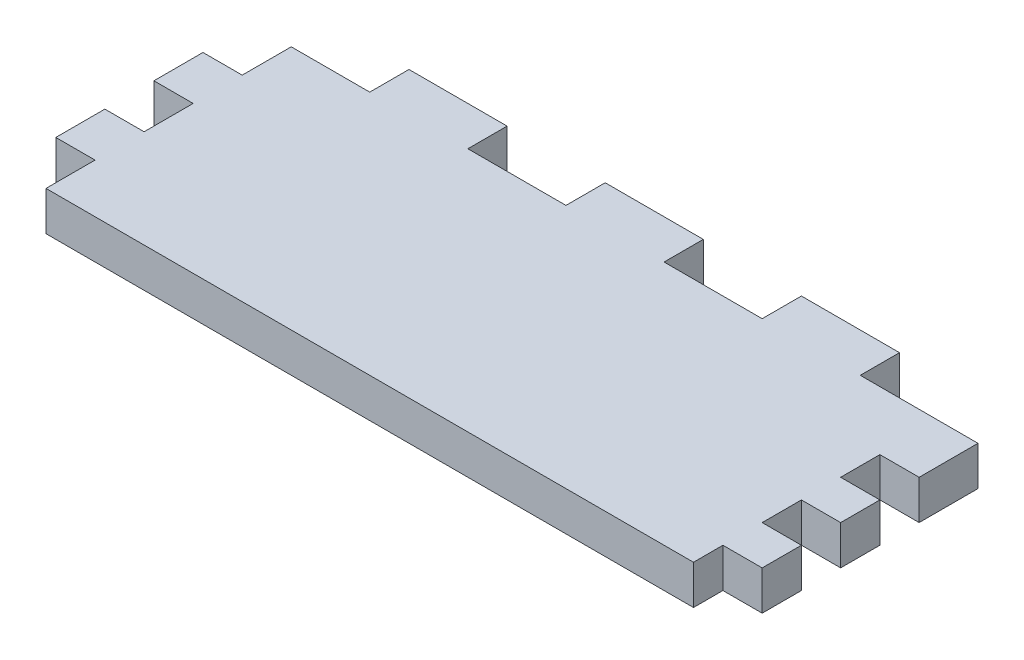
ISO-10303-21;
HEADER;
FILE_DESCRIPTION(('STEP AP214'),'2;1');
FILE_NAME('part.step','',(''),(''),'','','');
FILE_SCHEMA(('AUTOMOTIVE_DESIGN { 1 0 10303 214 1 1 1 1 }'));
ENDSEC;
DATA;
#1=APPLICATION_CONTEXT('core data for automotive mechanical design processes');
#2=APPLICATION_PROTOCOL_DEFINITION('international standard','automotive_design',2000,#1);
#3=PRODUCT_CONTEXT('',#1,'mechanical');
#4=PRODUCT('Part','Part','',(#3));
#5=PRODUCT_RELATED_PRODUCT_CATEGORY('part','',(#4));
#6=PRODUCT_DEFINITION_FORMATION('','',#4);
#7=PRODUCT_DEFINITION_CONTEXT('part definition',#1,'design');
#8=PRODUCT_DEFINITION('design','',#6,#7);
#9=PRODUCT_DEFINITION_SHAPE('','',#8);
#10=(LENGTH_UNIT() NAMED_UNIT(*) SI_UNIT(.MILLI.,.METRE.));
#11=(NAMED_UNIT(*) PLANE_ANGLE_UNIT() SI_UNIT($,.RADIAN.));
#12=(NAMED_UNIT(*) SI_UNIT($,.STERADIAN.) SOLID_ANGLE_UNIT());
#13=UNCERTAINTY_MEASURE_WITH_UNIT(LENGTH_MEASURE(1.E-05),#10,'distance_accuracy_value','');
#14=(GEOMETRIC_REPRESENTATION_CONTEXT(3) GLOBAL_UNCERTAINTY_ASSIGNED_CONTEXT((#13)) GLOBAL_UNIT_ASSIGNED_CONTEXT((#10,
#11,#12)) REPRESENTATION_CONTEXT('',''));
#15=CARTESIAN_POINT('',(0.,0.,0.));
#16=DIRECTION('',(0.,0.,1.));
#17=DIRECTION('',(1.,0.,0.));
#18=AXIS2_PLACEMENT_3D('',#15,#16,#17);
#19=CARTESIAN_POINT('',(66.,4.,0.));
#20=DIRECTION('',(-1.,0.,0.));
#21=DIRECTION('',(0.,0.,1.));
#22=AXIS2_PLACEMENT_3D('',#19,#20,#21);
#23=PLANE('',#22);
#24=DIRECTION('',(0.,0.,-1.));
#25=VECTOR('',#24,1.);
#26=CARTESIAN_POINT('',(66.,4.,0.));
#27=LINE('',#26,#25);
#28=CARTESIAN_POINT('',(66.,4.,18.0000000000002));
#29=VERTEX_POINT('',#28);
#30=CARTESIAN_POINT('',(66.,4.,14.0000000000002));
#31=VERTEX_POINT('',#30);
#32=EDGE_CURVE('E52',#29,#31,#27,.T.);
#33=ORIENTED_EDGE('',*,*,#32,.F.);
#34=DIRECTION('',(0.,1.,0.));
#35=VECTOR('',#34,1.);
#36=CARTESIAN_POINT('',(66.,0.,18.0000000000002));
#37=LINE('',#36,#35);
#38=CARTESIAN_POINT('',(66.,0.,18.0000000000002));
#39=VERTEX_POINT('',#38);
#40=EDGE_CURVE('E292',#39,#29,#37,.T.);
#41=ORIENTED_EDGE('',*,*,#40,.F.);
#42=DIRECTION('',(0.,0.,-1.));
#43=VECTOR('',#42,1.);
#44=CARTESIAN_POINT('',(66.,0.,0.));
#45=LINE('',#44,#43);
#46=CARTESIAN_POINT('',(66.,0.,14.0000000000002));
#47=VERTEX_POINT('',#46);
#48=EDGE_CURVE('E504',#39,#47,#45,.T.);
#49=ORIENTED_EDGE('',*,*,#48,.T.);
#50=DIRECTION('',(0.,1.,0.));
#51=VECTOR('',#50,1.);
#52=CARTESIAN_POINT('',(66.,0.,14.0000000000002));
#53=LINE('',#52,#51);
#54=EDGE_CURVE('E307',#47,#31,#53,.T.);
#55=ORIENTED_EDGE('',*,*,#54,.T.);
#56=EDGE_LOOP('',(#33,#41,#49,#55));
#57=FACE_BOUND('',#56,.T.);
#58=ADVANCED_FACE('F37',(#57),#23,.F.);
#59=CARTESIAN_POINT('',(66.,4.,10.0000000000002));
#60=VERTEX_POINT('',#59);
#61=CARTESIAN_POINT('',(66.,4.,6.00000000000023));
#62=VERTEX_POINT('',#61);
#63=EDGE_CURVE('E484',#60,#62,#27,.T.);
#64=ORIENTED_EDGE('',*,*,#63,.F.);
#65=DIRECTION('',(0.,1.,0.));
#66=VECTOR('',#65,1.);
#67=CARTESIAN_POINT('',(66.,0.,10.0000000000002));
#68=LINE('',#67,#66);
#69=CARTESIAN_POINT('',(66.,0.,10.0000000000002));
#70=VERTEX_POINT('',#69);
#71=EDGE_CURVE('E315',#70,#60,#68,.T.);
#72=ORIENTED_EDGE('',*,*,#71,.F.);
#73=CARTESIAN_POINT('',(66.,0.,6.00000000000023));
#74=VERTEX_POINT('',#73);
#75=EDGE_CURVE('E500',#70,#74,#45,.T.);
#76=ORIENTED_EDGE('',*,*,#75,.T.);
#77=DIRECTION('',(0.,1.,0.));
#78=VECTOR('',#77,1.);
#79=CARTESIAN_POINT('',(66.,0.,6.00000000000023));
#80=LINE('',#79,#78);
#81=EDGE_CURVE('E331',#74,#62,#80,.T.);
#82=ORIENTED_EDGE('',*,*,#81,.T.);
#83=EDGE_LOOP('',(#64,#72,#76,#82));
#84=FACE_BOUND('',#83,.T.);
#85=ADVANCED_FACE('F557',(#84),#23,.F.);
#86=CARTESIAN_POINT('',(0.,4.,0.));
#87=DIRECTION('',(0.,0.,1.));
#88=DIRECTION('',(1.,0.,0.));
#89=AXIS2_PLACEMENT_3D('',#86,#87,#88);
#90=PLANE('',#89);
#91=DIRECTION('',(-1.,0.,0.));
#92=VECTOR('',#91,1.);
#93=CARTESIAN_POINT('',(0.,0.,0.));
#94=LINE('',#93,#92);
#95=CARTESIAN_POINT('',(70.0000000000006,0.,0.));
#96=VERTEX_POINT('',#95);
#97=CARTESIAN_POINT('',(58.,0.,0.));
#98=VERTEX_POINT('',#97);
#99=EDGE_CURVE('E505',#96,#98,#94,.T.);
#100=ORIENTED_EDGE('',*,*,#99,.T.);
#101=DIRECTION('',(0.,1.,0.));
#102=VECTOR('',#101,1.);
#103=CARTESIAN_POINT('',(58.,0.,0.));
#104=LINE('',#103,#102);
#105=CARTESIAN_POINT('',(58.,4.,0.));
#106=VERTEX_POINT('',#105);
#107=EDGE_CURVE('E362',#98,#106,#104,.T.);
#108=ORIENTED_EDGE('',*,*,#107,.T.);
#109=DIRECTION('',(-1.,0.,0.));
#110=VECTOR('',#109,1.);
#111=CARTESIAN_POINT('',(0.,4.,0.));
#112=LINE('',#111,#110);
#113=CARTESIAN_POINT('',(70.0000000000006,4.,0.));
#114=VERTEX_POINT('',#113);
#115=EDGE_CURVE('E488',#114,#106,#112,.T.);
#116=ORIENTED_EDGE('',*,*,#115,.F.);
#117=DIRECTION('',(0.,1.,0.));
#118=VECTOR('',#117,1.);
#119=CARTESIAN_POINT('',(70.0000000000006,0.,0.));
#120=LINE('',#119,#118);
#121=EDGE_CURVE('E336',#96,#114,#120,.T.);
#122=ORIENTED_EDGE('',*,*,#121,.F.);
#123=EDGE_LOOP('',(#100,#108,#116,#122));
#124=FACE_BOUND('',#123,.T.);
#125=ADVANCED_FACE('F563',(#124),#90,.F.);
#126=CARTESIAN_POINT('',(28.,0.,0.));
#127=VERTEX_POINT('',#126);
#128=CARTESIAN_POINT('',(18.,0.,0.));
#129=VERTEX_POINT('',#128);
#130=EDGE_CURVE('E508',#127,#129,#94,.T.);
#131=ORIENTED_EDGE('',*,*,#130,.T.);
#132=DIRECTION('',(0.,1.,0.));
#133=VECTOR('',#132,1.);
#134=CARTESIAN_POINT('',(18.,0.,0.));
#135=LINE('',#134,#133);
#136=CARTESIAN_POINT('',(18.,4.,0.));
#137=VERTEX_POINT('',#136);
#138=EDGE_CURVE('E389',#129,#137,#135,.T.);
#139=ORIENTED_EDGE('',*,*,#138,.T.);
#140=CARTESIAN_POINT('',(28.,4.,0.));
#141=VERTEX_POINT('',#140);
#142=EDGE_CURVE('E493',#141,#137,#112,.T.);
#143=ORIENTED_EDGE('',*,*,#142,.F.);
#144=DIRECTION('',(0.,1.,0.));
#145=VECTOR('',#144,1.);
#146=CARTESIAN_POINT('',(28.,0.,0.));
#147=LINE('',#146,#145);
#148=EDGE_CURVE('E419',#127,#141,#147,.T.);
#149=ORIENTED_EDGE('',*,*,#148,.F.);
#150=EDGE_LOOP('',(#131,#139,#143,#149));
#151=FACE_BOUND('',#150,.T.);
#152=ADVANCED_FACE('F587',(#151),#90,.F.);
#153=CARTESIAN_POINT('',(8.,4.,0.));
#154=VERTEX_POINT('',#153);
#155=CARTESIAN_POINT('',(0.,4.,0.));
#156=VERTEX_POINT('',#155);
#157=EDGE_CURVE('E487',#154,#156,#112,.T.);
#158=ORIENTED_EDGE('',*,*,#157,.F.);
#159=DIRECTION('',(0.,1.,0.));
#160=VECTOR('',#159,1.);
#161=CARTESIAN_POINT('',(8.,0.,0.));
#162=LINE('',#161,#160);
#163=CARTESIAN_POINT('',(8.,0.,0.));
#164=VERTEX_POINT('',#163);
#165=EDGE_CURVE('E392',#164,#154,#162,.T.);
#166=ORIENTED_EDGE('',*,*,#165,.F.);
#167=CARTESIAN_POINT('',(0.,0.,0.));
#168=VERTEX_POINT('',#167);
#169=EDGE_CURVE('E503',#164,#168,#94,.T.);
#170=ORIENTED_EDGE('',*,*,#169,.T.);
#171=DIRECTION('',(0.,-1.,0.));
#172=VECTOR('',#171,1.);
#173=CARTESIAN_POINT('',(0.,4.,0.));
#174=LINE('',#173,#172);
#175=EDGE_CURVE('E491',#156,#168,#174,.T.);
#176=ORIENTED_EDGE('',*,*,#175,.F.);
#177=EDGE_LOOP('',(#158,#166,#170,#176));
#178=FACE_BOUND('',#177,.T.);
#179=ADVANCED_FACE('F574',(#178),#90,.F.);
#180=CARTESIAN_POINT('',(0.,4.,0.));
#181=DIRECTION('',(1.,0.,0.));
#182=DIRECTION('',(0.,0.,-1.));
#183=AXIS2_PLACEMENT_3D('',#180,#181,#182);
#184=PLANE('',#183);
#185=DIRECTION('',(0.,0.,1.));
#186=VECTOR('',#185,1.);
#187=CARTESIAN_POINT('',(0.,4.,0.));
#188=LINE('',#187,#186);
#189=CARTESIAN_POINT('',(0.,4.,20.));
#190=VERTEX_POINT('',#189);
#191=CARTESIAN_POINT('',(0.,4.,25.));
#192=VERTEX_POINT('',#191);
#193=EDGE_CURVE('E482',#190,#192,#188,.T.);
#194=ORIENTED_EDGE('',*,*,#193,.F.);
#195=DIRECTION('',(0.,1.,0.));
#196=VECTOR('',#195,1.);
#197=CARTESIAN_POINT('',(0.,0.,20.));
#198=LINE('',#197,#196);
#199=CARTESIAN_POINT('',(0.,0.,20.));
#200=VERTEX_POINT('',#199);
#201=EDGE_CURVE('E442',#200,#190,#198,.T.);
#202=ORIENTED_EDGE('',*,*,#201,.F.);
#203=DIRECTION('',(0.,0.,1.));
#204=VECTOR('',#203,1.);
#205=CARTESIAN_POINT('',(0.,0.,0.));
#206=LINE('',#205,#204);
#207=CARTESIAN_POINT('',(0.,0.,25.));
#208=VERTEX_POINT('',#207);
#209=EDGE_CURVE('E470',#200,#208,#206,.T.);
#210=ORIENTED_EDGE('',*,*,#209,.T.);
#211=DIRECTION('',(0.,-1.,0.));
#212=VECTOR('',#211,1.);
#213=CARTESIAN_POINT('',(0.,4.,25.));
#214=LINE('',#213,#212);
#215=EDGE_CURVE('E11',#192,#208,#214,.T.);
#216=ORIENTED_EDGE('',*,*,#215,.F.);
#217=EDGE_LOOP('',(#194,#202,#210,#216));
#218=FACE_BOUND('',#217,.T.);
#219=ADVANCED_FACE('F521',(#218),#184,.F.);
#220=CARTESIAN_POINT('',(0.,0.,10.));
#221=VERTEX_POINT('',#220);
#222=CARTESIAN_POINT('',(0.,0.,15.));
#223=VERTEX_POINT('',#222);
#224=EDGE_CURVE('E498',#221,#223,#206,.T.);
#225=ORIENTED_EDGE('',*,*,#224,.T.);
#226=DIRECTION('',(0.,1.,0.));
#227=VECTOR('',#226,1.);
#228=CARTESIAN_POINT('',(0.,0.,15.));
#229=LINE('',#228,#227);
#230=CARTESIAN_POINT('',(0.,4.,15.));
#231=VERTEX_POINT('',#230);
#232=EDGE_CURVE('E434',#223,#231,#229,.T.);
#233=ORIENTED_EDGE('',*,*,#232,.T.);
#234=CARTESIAN_POINT('',(0.,4.,10.));
#235=VERTEX_POINT('',#234);
#236=EDGE_CURVE('E481',#235,#231,#188,.T.);
#237=ORIENTED_EDGE('',*,*,#236,.F.);
#238=DIRECTION('',(0.,1.,0.));
#239=VECTOR('',#238,1.);
#240=CARTESIAN_POINT('',(0.,0.,10.));
#241=LINE('',#240,#239);
#242=EDGE_CURVE('E468',#221,#235,#241,.T.);
#243=ORIENTED_EDGE('',*,*,#242,.F.);
#244=EDGE_LOOP('',(#225,#233,#237,#243));
#245=FACE_BOUND('',#244,.T.);
#246=ADVANCED_FACE('F526',(#245),#184,.F.);
#247=CARTESIAN_POINT('',(0.,0.,5.));
#248=VERTEX_POINT('',#247);
#249=EDGE_CURVE('E494',#168,#248,#206,.T.);
#250=ORIENTED_EDGE('',*,*,#249,.T.);
#251=DIRECTION('',(0.,1.,0.));
#252=VECTOR('',#251,1.);
#253=CARTESIAN_POINT('',(0.,0.,5.));
#254=LINE('',#253,#252);
#255=CARTESIAN_POINT('',(0.,4.,5.));
#256=VERTEX_POINT('',#255);
#257=EDGE_CURVE('E460',#248,#256,#254,.T.);
#258=ORIENTED_EDGE('',*,*,#257,.T.);
#259=EDGE_CURVE('E477',#156,#256,#188,.T.);
#260=ORIENTED_EDGE('',*,*,#259,.F.);
#261=ORIENTED_EDGE('',*,*,#175,.T.);
#262=EDGE_LOOP('',(#250,#258,#260,#261));
#263=FACE_BOUND('',#262,.T.);
#264=ADVANCED_FACE('F39',(#263),#184,.F.);
#265=CARTESIAN_POINT('',(0.,4.,25.));
#266=DIRECTION('',(0.,0.,-1.));
#267=DIRECTION('',(-1.,0.,0.));
#268=AXIS2_PLACEMENT_3D('',#265,#266,#267);
#269=PLANE('',#268);
#270=DIRECTION('',(1.,0.,0.));
#271=VECTOR('',#270,1.);
#272=CARTESIAN_POINT('',(0.,0.,25.));
#273=LINE('',#272,#271);
#274=CARTESIAN_POINT('',(66.,0.,25.));
#275=VERTEX_POINT('',#274);
#276=EDGE_CURVE('E497',#208,#275,#273,.T.);
#277=ORIENTED_EDGE('',*,*,#276,.T.);
#278=DIRECTION('',(0.,-1.,0.));
#279=VECTOR('',#278,1.);
#280=CARTESIAN_POINT('',(66.,4.,25.));
#281=LINE('',#280,#279);
#282=CARTESIAN_POINT('',(66.,4.,25.));
#283=VERTEX_POINT('',#282);
#284=EDGE_CURVE('E45',#283,#275,#281,.T.);
#285=ORIENTED_EDGE('',*,*,#284,.F.);
#286=DIRECTION('',(1.,0.,0.));
#287=VECTOR('',#286,1.);
#288=CARTESIAN_POINT('',(0.,4.,25.));
#289=LINE('',#288,#287);
#290=EDGE_CURVE('E480',#192,#283,#289,.T.);
#291=ORIENTED_EDGE('',*,*,#290,.F.);
#292=ORIENTED_EDGE('',*,*,#215,.T.);
#293=EDGE_LOOP('',(#277,#285,#291,#292));
#294=FACE_BOUND('',#293,.T.);
#295=ADVANCED_FACE('F519',(#294),#269,.F.);
#296=CARTESIAN_POINT('',(66.,0.,22.0000000000001));
#297=VERTEX_POINT('',#296);
#298=EDGE_CURVE('E501',#275,#297,#45,.T.);
#299=ORIENTED_EDGE('',*,*,#298,.T.);
#300=DIRECTION('',(0.,1.,0.));
#301=VECTOR('',#300,1.);
#302=CARTESIAN_POINT('',(66.,0.,22.0000000000001));
#303=LINE('',#302,#301);
#304=CARTESIAN_POINT('',(66.,4.,22.0000000000001));
#305=VERTEX_POINT('',#304);
#306=EDGE_CURVE('E60',#297,#305,#303,.T.);
#307=ORIENTED_EDGE('',*,*,#306,.T.);
#308=EDGE_CURVE('E485',#283,#305,#27,.T.);
#309=ORIENTED_EDGE('',*,*,#308,.F.);
#310=ORIENTED_EDGE('',*,*,#284,.T.);
#311=EDGE_LOOP('',(#299,#307,#309,#310));
#312=FACE_BOUND('',#311,.T.);
#313=ADVANCED_FACE('F512',(#312),#23,.F.);
#314=CARTESIAN_POINT('',(48.,4.,0.));
#315=VERTEX_POINT('',#314);
#316=CARTESIAN_POINT('',(38.,4.,0.));
#317=VERTEX_POINT('',#316);
#318=EDGE_CURVE('E492',#315,#317,#112,.T.);
#319=ORIENTED_EDGE('',*,*,#318,.F.);
#320=DIRECTION('',(0.,1.,0.));
#321=VECTOR('',#320,1.);
#322=CARTESIAN_POINT('',(48.,0.,0.));
#323=LINE('',#322,#321);
#324=CARTESIAN_POINT('',(48.,0.,0.));
#325=VERTEX_POINT('',#324);
#326=EDGE_CURVE('E365',#325,#315,#323,.T.);
#327=ORIENTED_EDGE('',*,*,#326,.F.);
#328=CARTESIAN_POINT('',(38.,0.,0.));
#329=VERTEX_POINT('',#328);
#330=EDGE_CURVE('E507',#325,#329,#94,.T.);
#331=ORIENTED_EDGE('',*,*,#330,.T.);
#332=DIRECTION('',(0.,1.,0.));
#333=VECTOR('',#332,1.);
#334=CARTESIAN_POINT('',(38.,0.,0.));
#335=LINE('',#334,#333);
#336=EDGE_CURVE('E415',#329,#317,#335,.T.);
#337=ORIENTED_EDGE('',*,*,#336,.T.);
#338=EDGE_LOOP('',(#319,#327,#331,#337));
#339=FACE_BOUND('',#338,.T.);
#340=ADVANCED_FACE('F567',(#339),#90,.F.);
#341=CARTESIAN_POINT('',(0.,4.,0.));
#342=DIRECTION('',(0.,1.,0.));
#343=DIRECTION('',(0.,0.,1.));
#344=AXIS2_PLACEMENT_3D('',#341,#342,#343);
#345=PLANE('',#344);
#346=ORIENTED_EDGE('',*,*,#259,.T.);
#347=DIRECTION('',(-1.,0.,0.));
#348=VECTOR('',#347,1.);
#349=CARTESIAN_POINT('',(0.,4.,5.));
#350=LINE('',#349,#348);
#351=CARTESIAN_POINT('',(-4.,4.,5.));
#352=VERTEX_POINT('',#351);
#353=EDGE_CURVE('E445',#256,#352,#350,.T.);
#354=ORIENTED_EDGE('',*,*,#353,.T.);
#355=DIRECTION('',(0.,0.,1.));
#356=VECTOR('',#355,1.);
#357=CARTESIAN_POINT('',(-4.,4.,5.));
#358=LINE('',#357,#356);
#359=CARTESIAN_POINT('',(-4.,4.,10.));
#360=VERTEX_POINT('',#359);
#361=EDGE_CURVE('E463',#352,#360,#358,.T.);
#362=ORIENTED_EDGE('',*,*,#361,.T.);
#363=DIRECTION('',(1.,0.,0.));
#364=VECTOR('',#363,1.);
#365=CARTESIAN_POINT('',(0.,4.,10.));
#366=LINE('',#365,#364);
#367=EDGE_CURVE('E455',#360,#235,#366,.T.);
#368=ORIENTED_EDGE('',*,*,#367,.T.);
#369=ORIENTED_EDGE('',*,*,#236,.T.);
#370=DIRECTION('',(-1.,0.,0.));
#371=VECTOR('',#370,1.);
#372=CARTESIAN_POINT('',(0.,4.,15.));
#373=LINE('',#372,#371);
#374=CARTESIAN_POINT('',(-4.,4.,15.));
#375=VERTEX_POINT('',#374);
#376=EDGE_CURVE('E418',#231,#375,#373,.T.);
#377=ORIENTED_EDGE('',*,*,#376,.T.);
#378=DIRECTION('',(0.,0.,1.));
#379=VECTOR('',#378,1.);
#380=CARTESIAN_POINT('',(-4.,4.,15.));
#381=LINE('',#380,#379);
#382=CARTESIAN_POINT('',(-4.,4.,20.));
#383=VERTEX_POINT('',#382);
#384=EDGE_CURVE('E437',#375,#383,#381,.T.);
#385=ORIENTED_EDGE('',*,*,#384,.T.);
#386=DIRECTION('',(1.,0.,0.));
#387=VECTOR('',#386,1.);
#388=CARTESIAN_POINT('',(0.,4.,20.));
#389=LINE('',#388,#387);
#390=EDGE_CURVE('E428',#383,#190,#389,.T.);
#391=ORIENTED_EDGE('',*,*,#390,.T.);
#392=ORIENTED_EDGE('',*,*,#193,.T.);
#393=ORIENTED_EDGE('',*,*,#290,.T.);
#394=ORIENTED_EDGE('',*,*,#308,.T.);
#395=DIRECTION('',(1.,0.,0.));
#396=VECTOR('',#395,1.);
#397=CARTESIAN_POINT('',(66.,4.,22.0000000000001));
#398=LINE('',#397,#396);
#399=CARTESIAN_POINT('',(70.0000000000006,4.,22.0000000000001));
#400=VERTEX_POINT('',#399);
#401=EDGE_CURVE('E289',#305,#400,#398,.T.);
#402=ORIENTED_EDGE('',*,*,#401,.T.);
#403=DIRECTION('',(0.,0.,-1.));
#404=VECTOR('',#403,1.);
#405=CARTESIAN_POINT('',(70.0000000000006,4.,18.0000000000002));
#406=LINE('',#405,#404);
#407=CARTESIAN_POINT('',(70.0000000000006,4.,18.0000000000002));
#408=VERTEX_POINT('',#407);
#409=EDGE_CURVE('E266',#400,#408,#406,.T.);
#410=ORIENTED_EDGE('',*,*,#409,.T.);
#411=DIRECTION('',(-1.,0.,0.));
#412=VECTOR('',#411,1.);
#413=CARTESIAN_POINT('',(66.,4.,18.0000000000002));
#414=LINE('',#413,#412);
#415=EDGE_CURVE('E283',#408,#29,#414,.T.);
#416=ORIENTED_EDGE('',*,*,#415,.T.);
#417=ORIENTED_EDGE('',*,*,#32,.T.);
#418=DIRECTION('',(1.,0.,0.));
#419=VECTOR('',#418,1.);
#420=CARTESIAN_POINT('',(66.,4.,14.0000000000002));
#421=LINE('',#420,#419);
#422=CARTESIAN_POINT('',(70.0000000000006,4.,14.0000000000002));
#423=VERTEX_POINT('',#422);
#424=EDGE_CURVE('E294',#31,#423,#421,.T.);
#425=ORIENTED_EDGE('',*,*,#424,.T.);
#426=DIRECTION('',(0.,0.,-1.));
#427=VECTOR('',#426,1.);
#428=CARTESIAN_POINT('',(70.0000000000006,4.,10.0000000000002));
#429=LINE('',#428,#427);
#430=CARTESIAN_POINT('',(70.0000000000006,4.,10.0000000000002));
#431=VERTEX_POINT('',#430);
#432=EDGE_CURVE('E310',#423,#431,#429,.T.);
#433=ORIENTED_EDGE('',*,*,#432,.T.);
#434=DIRECTION('',(-1.,0.,0.));
#435=VECTOR('',#434,1.);
#436=CARTESIAN_POINT('',(66.,4.,10.0000000000002));
#437=LINE('',#436,#435);
#438=EDGE_CURVE('E301',#431,#60,#437,.T.);
#439=ORIENTED_EDGE('',*,*,#438,.T.);
#440=ORIENTED_EDGE('',*,*,#63,.T.);
#441=DIRECTION('',(1.,0.,0.));
#442=VECTOR('',#441,1.);
#443=CARTESIAN_POINT('',(66.,4.,6.00000000000023));
#444=LINE('',#443,#442);
#445=CARTESIAN_POINT('',(70.0000000000006,4.,6.00000000000023));
#446=VERTEX_POINT('',#445);
#447=EDGE_CURVE('E318',#62,#446,#444,.T.);
#448=ORIENTED_EDGE('',*,*,#447,.T.);
#449=DIRECTION('',(0.,0.,-1.));
#450=VECTOR('',#449,1.);
#451=CARTESIAN_POINT('',(70.0000000000006,4.,0.));
#452=LINE('',#451,#450);
#453=EDGE_CURVE('E328',#446,#114,#452,.T.);
#454=ORIENTED_EDGE('',*,*,#453,.T.);
#455=ORIENTED_EDGE('',*,*,#115,.T.);
#456=DIRECTION('',(0.,0.,-1.));
#457=VECTOR('',#456,1.);
#458=CARTESIAN_POINT('',(58.,4.,0.));
#459=LINE('',#458,#457);
#460=CARTESIAN_POINT('',(58.,4.,-3.99999999999999));
#461=VERTEX_POINT('',#460);
#462=EDGE_CURVE('E339',#106,#461,#459,.T.);
#463=ORIENTED_EDGE('',*,*,#462,.T.);
#464=DIRECTION('',(-1.,0.,0.));
#465=VECTOR('',#464,1.);
#466=CARTESIAN_POINT('',(48.,4.,-3.99999999999999));
#467=LINE('',#466,#465);
#468=CARTESIAN_POINT('',(48.,4.,-3.99999999999999));
#469=VERTEX_POINT('',#468);
#470=EDGE_CURVE('E357',#461,#469,#467,.T.);
#471=ORIENTED_EDGE('',*,*,#470,.T.);
#472=DIRECTION('',(0.,0.,1.));
#473=VECTOR('',#472,1.);
#474=CARTESIAN_POINT('',(48.,4.,0.));
#475=LINE('',#474,#473);
#476=EDGE_CURVE('E348',#469,#315,#475,.T.);
#477=ORIENTED_EDGE('',*,*,#476,.T.);
#478=ORIENTED_EDGE('',*,*,#318,.T.);
#479=DIRECTION('',(0.,0.,-1.));
#480=VECTOR('',#479,1.);
#481=CARTESIAN_POINT('',(38.,4.,0.));
#482=LINE('',#481,#480);
#483=CARTESIAN_POINT('',(38.,4.,-3.99999999999999));
#484=VERTEX_POINT('',#483);
#485=EDGE_CURVE('E391',#317,#484,#482,.T.);
#486=ORIENTED_EDGE('',*,*,#485,.T.);
#487=DIRECTION('',(-1.,0.,0.));
#488=VECTOR('',#487,1.);
#489=CARTESIAN_POINT('',(28.,4.,-3.99999999999999));
#490=LINE('',#489,#488);
#491=CARTESIAN_POINT('',(28.,4.,-3.99999999999999));
#492=VERTEX_POINT('',#491);
#493=EDGE_CURVE('E410',#484,#492,#490,.T.);
#494=ORIENTED_EDGE('',*,*,#493,.T.);
#495=DIRECTION('',(0.,0.,1.));
#496=VECTOR('',#495,1.);
#497=CARTESIAN_POINT('',(28.,4.,0.));
#498=LINE('',#497,#496);
#499=EDGE_CURVE('E402',#492,#141,#498,.T.);
#500=ORIENTED_EDGE('',*,*,#499,.T.);
#501=ORIENTED_EDGE('',*,*,#142,.T.);
#502=DIRECTION('',(0.,0.,-1.));
#503=VECTOR('',#502,1.);
#504=CARTESIAN_POINT('',(18.,4.,0.));
#505=LINE('',#504,#503);
#506=CARTESIAN_POINT('',(18.,4.,-4.));
#507=VERTEX_POINT('',#506);
#508=EDGE_CURVE('E364',#137,#507,#505,.T.);
#509=ORIENTED_EDGE('',*,*,#508,.T.);
#510=DIRECTION('',(-1.,0.,0.));
#511=VECTOR('',#510,1.);
#512=CARTESIAN_POINT('',(8.,4.,-4.));
#513=LINE('',#512,#511);
#514=CARTESIAN_POINT('',(8.,4.,-4.));
#515=VERTEX_POINT('',#514);
#516=EDGE_CURVE('E384',#507,#515,#513,.T.);
#517=ORIENTED_EDGE('',*,*,#516,.T.);
#518=DIRECTION('',(0.,0.,1.));
#519=VECTOR('',#518,1.);
#520=CARTESIAN_POINT('',(8.,4.,0.));
#521=LINE('',#520,#519);
#522=EDGE_CURVE('E375',#515,#154,#521,.T.);
#523=ORIENTED_EDGE('',*,*,#522,.T.);
#524=ORIENTED_EDGE('',*,*,#157,.T.);
#525=EDGE_LOOP('',(#346,#354,#362,#368,#369,#377,#385,#391,#392,#393,#394,#402,#410,#416,#417,
#425,#433,#439,#440,#448,#454,#455,#463,#471,#477,#478,#486,#494,#500,#501,#509,#517,#523,#524));
#526=FACE_BOUND('',#525,.T.);
#527=ADVANCED_FACE('F540',(#526),#345,.T.);
#528=CARTESIAN_POINT('',(0.,0.,0.));
#529=DIRECTION('',(0.,1.,0.));
#530=DIRECTION('',(0.,0.,1.));
#531=AXIS2_PLACEMENT_3D('',#528,#529,#530);
#532=PLANE('',#531);
#533=ORIENTED_EDGE('',*,*,#249,.F.);
#534=ORIENTED_EDGE('',*,*,#169,.F.);
#535=DIRECTION('',(0.,0.,1.));
#536=VECTOR('',#535,1.);
#537=CARTESIAN_POINT('',(8.,0.,0.));
#538=LINE('',#537,#536);
#539=CARTESIAN_POINT('',(8.,0.,-4.));
#540=VERTEX_POINT('',#539);
#541=EDGE_CURVE('E378',#540,#164,#538,.T.);
#542=ORIENTED_EDGE('',*,*,#541,.F.);
#543=DIRECTION('',(-1.,0.,0.));
#544=VECTOR('',#543,1.);
#545=CARTESIAN_POINT('',(8.,0.,-4.));
#546=LINE('',#545,#544);
#547=CARTESIAN_POINT('',(18.,0.,-4.));
#548=VERTEX_POINT('',#547);
#549=EDGE_CURVE('E374',#548,#540,#546,.T.);
#550=ORIENTED_EDGE('',*,*,#549,.F.);
#551=DIRECTION('',(0.,0.,-1.));
#552=VECTOR('',#551,1.);
#553=CARTESIAN_POINT('',(18.,0.,0.));
#554=LINE('',#553,#552);
#555=EDGE_CURVE('E371',#129,#548,#554,.T.);
#556=ORIENTED_EDGE('',*,*,#555,.F.);
#557=ORIENTED_EDGE('',*,*,#130,.F.);
#558=DIRECTION('',(0.,0.,1.));
#559=VECTOR('',#558,1.);
#560=CARTESIAN_POINT('',(28.,0.,0.));
#561=LINE('',#560,#559);
#562=CARTESIAN_POINT('',(28.,0.,-3.99999999999999));
#563=VERTEX_POINT('',#562);
#564=EDGE_CURVE('E405',#563,#127,#561,.T.);
#565=ORIENTED_EDGE('',*,*,#564,.F.);
#566=DIRECTION('',(-1.,0.,0.));
#567=VECTOR('',#566,1.);
#568=CARTESIAN_POINT('',(28.,0.,-3.99999999999999));
#569=LINE('',#568,#567);
#570=CARTESIAN_POINT('',(38.,0.,-3.99999999999999));
#571=VERTEX_POINT('',#570);
#572=EDGE_CURVE('E401',#571,#563,#569,.T.);
#573=ORIENTED_EDGE('',*,*,#572,.F.);
#574=DIRECTION('',(0.,0.,-1.));
#575=VECTOR('',#574,1.);
#576=CARTESIAN_POINT('',(38.,0.,0.));
#577=LINE('',#576,#575);
#578=EDGE_CURVE('E398',#329,#571,#577,.T.);
#579=ORIENTED_EDGE('',*,*,#578,.F.);
#580=ORIENTED_EDGE('',*,*,#330,.F.);
#581=DIRECTION('',(0.,0.,1.));
#582=VECTOR('',#581,1.);
#583=CARTESIAN_POINT('',(48.,0.,0.));
#584=LINE('',#583,#582);
#585=CARTESIAN_POINT('',(48.,0.,-3.99999999999999));
#586=VERTEX_POINT('',#585);
#587=EDGE_CURVE('E351',#586,#325,#584,.T.);
#588=ORIENTED_EDGE('',*,*,#587,.F.);
#589=DIRECTION('',(-1.,0.,0.));
#590=VECTOR('',#589,1.);
#591=CARTESIAN_POINT('',(48.,0.,-3.99999999999999));
#592=LINE('',#591,#590);
#593=CARTESIAN_POINT('',(58.,0.,-3.99999999999999));
#594=VERTEX_POINT('',#593);
#595=EDGE_CURVE('E347',#594,#586,#592,.T.);
#596=ORIENTED_EDGE('',*,*,#595,.F.);
#597=DIRECTION('',(0.,0.,-1.));
#598=VECTOR('',#597,1.);
#599=CARTESIAN_POINT('',(58.,0.,0.));
#600=LINE('',#599,#598);
#601=EDGE_CURVE('E344',#98,#594,#600,.T.);
#602=ORIENTED_EDGE('',*,*,#601,.F.);
#603=ORIENTED_EDGE('',*,*,#99,.F.);
#604=DIRECTION('',(0.,0.,-1.));
#605=VECTOR('',#604,1.);
#606=CARTESIAN_POINT('',(70.0000000000006,0.,0.));
#607=LINE('',#606,#605);
#608=CARTESIAN_POINT('',(70.0000000000006,0.,6.00000000000023));
#609=VERTEX_POINT('',#608);
#610=EDGE_CURVE('E327',#609,#96,#607,.T.);
#611=ORIENTED_EDGE('',*,*,#610,.F.);
#612=DIRECTION('',(1.,0.,0.));
#613=VECTOR('',#612,1.);
#614=CARTESIAN_POINT('',(66.,0.,6.00000000000023));
#615=LINE('',#614,#613);
#616=EDGE_CURVE('E324',#74,#609,#615,.T.);
#617=ORIENTED_EDGE('',*,*,#616,.F.);
#618=ORIENTED_EDGE('',*,*,#75,.F.);
#619=DIRECTION('',(-1.,0.,0.));
#620=VECTOR('',#619,1.);
#621=CARTESIAN_POINT('',(66.,0.,10.0000000000002));
#622=LINE('',#621,#620);
#623=CARTESIAN_POINT('',(70.0000000000006,0.,10.0000000000002));
#624=VERTEX_POINT('',#623);
#625=EDGE_CURVE('E304',#624,#70,#622,.T.);
#626=ORIENTED_EDGE('',*,*,#625,.F.);
#627=DIRECTION('',(0.,0.,-1.));
#628=VECTOR('',#627,1.);
#629=CARTESIAN_POINT('',(70.0000000000006,0.,10.0000000000002));
#630=LINE('',#629,#628);
#631=CARTESIAN_POINT('',(70.0000000000006,0.,14.0000000000002));
#632=VERTEX_POINT('',#631);
#633=EDGE_CURVE('E300',#632,#624,#630,.T.);
#634=ORIENTED_EDGE('',*,*,#633,.F.);
#635=DIRECTION('',(1.,0.,0.));
#636=VECTOR('',#635,1.);
#637=CARTESIAN_POINT('',(66.,0.,14.0000000000002));
#638=LINE('',#637,#636);
#639=EDGE_CURVE('E297',#47,#632,#638,.T.);
#640=ORIENTED_EDGE('',*,*,#639,.F.);
#641=ORIENTED_EDGE('',*,*,#48,.F.);
#642=DIRECTION('',(-1.,0.,0.));
#643=VECTOR('',#642,1.);
#644=CARTESIAN_POINT('',(66.,0.,18.0000000000002));
#645=LINE('',#644,#643);
#646=CARTESIAN_POINT('',(70.0000000000006,0.,18.0000000000002));
#647=VERTEX_POINT('',#646);
#648=EDGE_CURVE('E280',#647,#39,#645,.T.);
#649=ORIENTED_EDGE('',*,*,#648,.F.);
#650=DIRECTION('',(0.,0.,-1.));
#651=VECTOR('',#650,1.);
#652=CARTESIAN_POINT('',(70.0000000000006,0.,18.0000000000002));
#653=LINE('',#652,#651);
#654=CARTESIAN_POINT('',(70.0000000000006,0.,22.0000000000001));
#655=VERTEX_POINT('',#654);
#656=EDGE_CURVE('E263',#655,#647,#653,.T.);
#657=ORIENTED_EDGE('',*,*,#656,.F.);
#658=DIRECTION('',(1.,0.,0.));
#659=VECTOR('',#658,1.);
#660=CARTESIAN_POINT('',(66.,0.,22.0000000000001));
#661=LINE('',#660,#659);
#662=EDGE_CURVE('E278',#297,#655,#661,.T.);
#663=ORIENTED_EDGE('',*,*,#662,.F.);
#664=ORIENTED_EDGE('',*,*,#298,.F.);
#665=ORIENTED_EDGE('',*,*,#276,.F.);
#666=ORIENTED_EDGE('',*,*,#209,.F.);
#667=DIRECTION('',(1.,0.,0.));
#668=VECTOR('',#667,1.);
#669=CARTESIAN_POINT('',(0.,0.,20.));
#670=LINE('',#669,#668);
#671=CARTESIAN_POINT('',(-4.,0.,20.));
#672=VERTEX_POINT('',#671);
#673=EDGE_CURVE('E431',#672,#200,#670,.T.);
#674=ORIENTED_EDGE('',*,*,#673,.F.);
#675=DIRECTION('',(0.,0.,1.));
#676=VECTOR('',#675,1.);
#677=CARTESIAN_POINT('',(-4.,0.,15.));
#678=LINE('',#677,#676);
#679=CARTESIAN_POINT('',(-4.,0.,15.));
#680=VERTEX_POINT('',#679);
#681=EDGE_CURVE('E427',#680,#672,#678,.T.);
#682=ORIENTED_EDGE('',*,*,#681,.F.);
#683=DIRECTION('',(-1.,0.,0.));
#684=VECTOR('',#683,1.);
#685=CARTESIAN_POINT('',(0.,0.,15.));
#686=LINE('',#685,#684);
#687=EDGE_CURVE('E424',#223,#680,#686,.T.);
#688=ORIENTED_EDGE('',*,*,#687,.F.);
#689=ORIENTED_EDGE('',*,*,#224,.F.);
#690=DIRECTION('',(1.,0.,0.));
#691=VECTOR('',#690,1.);
#692=CARTESIAN_POINT('',(0.,0.,10.));
#693=LINE('',#692,#691);
#694=CARTESIAN_POINT('',(-4.,0.,10.));
#695=VERTEX_POINT('',#694);
#696=EDGE_CURVE('E458',#695,#221,#693,.T.);
#697=ORIENTED_EDGE('',*,*,#696,.F.);
#698=DIRECTION('',(0.,0.,1.));
#699=VECTOR('',#698,1.);
#700=CARTESIAN_POINT('',(-4.,0.,5.));
#701=LINE('',#700,#699);
#702=CARTESIAN_POINT('',(-4.,0.,5.));
#703=VERTEX_POINT('',#702);
#704=EDGE_CURVE('E454',#703,#695,#701,.T.);
#705=ORIENTED_EDGE('',*,*,#704,.F.);
#706=DIRECTION('',(-1.,0.,0.));
#707=VECTOR('',#706,1.);
#708=CARTESIAN_POINT('',(0.,0.,5.));
#709=LINE('',#708,#707);
#710=EDGE_CURVE('E451',#248,#703,#709,.T.);
#711=ORIENTED_EDGE('',*,*,#710,.F.);
#712=EDGE_LOOP('',(#533,#534,#542,#550,#556,#557,#565,#573,#579,#580,#588,#596,#602,#603,#611,
#617,#618,#626,#634,#640,#641,#649,#657,#663,#664,#665,#666,#674,#682,#688,#689,#697,#705,#711));
#713=FACE_BOUND('',#712,.T.);
#714=ADVANCED_FACE('F276',(#713),#532,.F.);
#715=CARTESIAN_POINT('',(0.,0.,10.));
#716=DIRECTION('',(0.,0.,1.));
#717=DIRECTION('',(1.,0.,0.));
#718=AXIS2_PLACEMENT_3D('',#715,#716,#717);
#719=PLANE('',#718);
#720=ORIENTED_EDGE('',*,*,#367,.F.);
#721=DIRECTION('',(0.,1.,0.));
#722=VECTOR('',#721,1.);
#723=CARTESIAN_POINT('',(-4.,0.,10.));
#724=LINE('',#723,#722);
#725=EDGE_CURVE('E471',#695,#360,#724,.T.);
#726=ORIENTED_EDGE('',*,*,#725,.F.);
#727=ORIENTED_EDGE('',*,*,#696,.T.);
#728=ORIENTED_EDGE('',*,*,#242,.T.);
#729=EDGE_LOOP('',(#720,#726,#727,#728));
#730=FACE_BOUND('',#729,.T.);
#731=ADVANCED_FACE('F596',(#730),#719,.T.);
#732=CARTESIAN_POINT('',(-4.,0.,5.));
#733=DIRECTION('',(-1.,0.,0.));
#734=DIRECTION('',(0.,0.,1.));
#735=AXIS2_PLACEMENT_3D('',#732,#733,#734);
#736=PLANE('',#735);
#737=ORIENTED_EDGE('',*,*,#361,.F.);
#738=DIRECTION('',(0.,1.,0.));
#739=VECTOR('',#738,1.);
#740=CARTESIAN_POINT('',(-4.,0.,5.));
#741=LINE('',#740,#739);
#742=EDGE_CURVE('E473',#703,#352,#741,.T.);
#743=ORIENTED_EDGE('',*,*,#742,.F.);
#744=ORIENTED_EDGE('',*,*,#704,.T.);
#745=ORIENTED_EDGE('',*,*,#725,.T.);
#746=EDGE_LOOP('',(#737,#743,#744,#745));
#747=FACE_BOUND('',#746,.T.);
#748=ADVANCED_FACE('F552',(#747),#736,.T.);
#749=CARTESIAN_POINT('',(0.,0.,5.));
#750=DIRECTION('',(0.,0.,-1.));
#751=DIRECTION('',(-1.,0.,0.));
#752=AXIS2_PLACEMENT_3D('',#749,#750,#751);
#753=PLANE('',#752);
#754=ORIENTED_EDGE('',*,*,#353,.F.);
#755=ORIENTED_EDGE('',*,*,#257,.F.);
#756=ORIENTED_EDGE('',*,*,#710,.T.);
#757=ORIENTED_EDGE('',*,*,#742,.T.);
#758=EDGE_LOOP('',(#754,#755,#756,#757));
#759=FACE_BOUND('',#758,.T.);
#760=ADVANCED_FACE('F545',(#759),#753,.T.);
#761=CARTESIAN_POINT('',(0.,0.,20.));
#762=DIRECTION('',(0.,0.,1.));
#763=DIRECTION('',(1.,0.,0.));
#764=AXIS2_PLACEMENT_3D('',#761,#762,#763);
#765=PLANE('',#764);
#766=ORIENTED_EDGE('',*,*,#390,.F.);
#767=DIRECTION('',(0.,1.,0.));
#768=VECTOR('',#767,1.);
#769=CARTESIAN_POINT('',(-4.,0.,20.));
#770=LINE('',#769,#768);
#771=EDGE_CURVE('E446',#672,#383,#770,.T.);
#772=ORIENTED_EDGE('',*,*,#771,.F.);
#773=ORIENTED_EDGE('',*,*,#673,.T.);
#774=ORIENTED_EDGE('',*,*,#201,.T.);
#775=EDGE_LOOP('',(#766,#772,#773,#774));
#776=FACE_BOUND('',#775,.T.);
#777=ADVANCED_FACE('F543',(#776),#765,.T.);
#778=CARTESIAN_POINT('',(-4.,0.,15.));
#779=DIRECTION('',(-1.,0.,0.));
#780=DIRECTION('',(0.,0.,1.));
#781=AXIS2_PLACEMENT_3D('',#778,#779,#780);
#782=PLANE('',#781);
#783=ORIENTED_EDGE('',*,*,#384,.F.);
#784=DIRECTION('',(0.,1.,0.));
#785=VECTOR('',#784,1.);
#786=CARTESIAN_POINT('',(-4.,0.,15.));
#787=LINE('',#786,#785);
#788=EDGE_CURVE('E448',#680,#375,#787,.T.);
#789=ORIENTED_EDGE('',*,*,#788,.F.);
#790=ORIENTED_EDGE('',*,*,#681,.T.);
#791=ORIENTED_EDGE('',*,*,#771,.T.);
#792=EDGE_LOOP('',(#783,#789,#790,#791));
#793=FACE_BOUND('',#792,.T.);
#794=ADVANCED_FACE('F537',(#793),#782,.T.);
#795=CARTESIAN_POINT('',(0.,0.,15.));
#796=DIRECTION('',(0.,0.,-1.));
#797=DIRECTION('',(-1.,0.,0.));
#798=AXIS2_PLACEMENT_3D('',#795,#796,#797);
#799=PLANE('',#798);
#800=ORIENTED_EDGE('',*,*,#376,.F.);
#801=ORIENTED_EDGE('',*,*,#232,.F.);
#802=ORIENTED_EDGE('',*,*,#687,.T.);
#803=ORIENTED_EDGE('',*,*,#788,.T.);
#804=EDGE_LOOP('',(#800,#801,#802,#803));
#805=FACE_BOUND('',#804,.T.);
#806=ADVANCED_FACE('F533',(#805),#799,.T.);
#807=CARTESIAN_POINT('',(38.,0.,0.));
#808=DIRECTION('',(1.,0.,0.));
#809=DIRECTION('',(0.,0.,-1.));
#810=AXIS2_PLACEMENT_3D('',#807,#808,#809);
#811=PLANE('',#810);
#812=ORIENTED_EDGE('',*,*,#485,.F.);
#813=ORIENTED_EDGE('',*,*,#336,.F.);
#814=ORIENTED_EDGE('',*,*,#578,.T.);
#815=DIRECTION('',(0.,1.,0.));
#816=VECTOR('',#815,1.);
#817=CARTESIAN_POINT('',(38.,0.,-3.99999999999999));
#818=LINE('',#817,#816);
#819=EDGE_CURVE('E407',#571,#484,#818,.T.);
#820=ORIENTED_EDGE('',*,*,#819,.T.);
#821=EDGE_LOOP('',(#812,#813,#814,#820));
#822=FACE_BOUND('',#821,.T.);
#823=ADVANCED_FACE('F606',(#822),#811,.T.);
#824=CARTESIAN_POINT('',(28.,0.,0.));
#825=DIRECTION('',(-1.,0.,0.));
#826=DIRECTION('',(0.,0.,1.));
#827=AXIS2_PLACEMENT_3D('',#824,#825,#826);
#828=PLANE('',#827);
#829=ORIENTED_EDGE('',*,*,#499,.F.);
#830=DIRECTION('',(0.,1.,0.));
#831=VECTOR('',#830,1.);
#832=CARTESIAN_POINT('',(28.,0.,-3.99999999999999));
#833=LINE('',#832,#831);
#834=EDGE_CURVE('E421',#563,#492,#833,.T.);
#835=ORIENTED_EDGE('',*,*,#834,.F.);
#836=ORIENTED_EDGE('',*,*,#564,.T.);
#837=ORIENTED_EDGE('',*,*,#148,.T.);
#838=EDGE_LOOP('',(#829,#835,#836,#837));
#839=FACE_BOUND('',#838,.T.);
#840=ADVANCED_FACE('F610',(#839),#828,.T.);
#841=CARTESIAN_POINT('',(28.,0.,-3.99999999999999));
#842=DIRECTION('',(0.,0.,-1.));
#843=DIRECTION('',(-1.,0.,0.));
#844=AXIS2_PLACEMENT_3D('',#841,#842,#843);
#845=PLANE('',#844);
#846=ORIENTED_EDGE('',*,*,#493,.F.);
#847=ORIENTED_EDGE('',*,*,#819,.F.);
#848=ORIENTED_EDGE('',*,*,#572,.T.);
#849=ORIENTED_EDGE('',*,*,#834,.T.);
#850=EDGE_LOOP('',(#846,#847,#848,#849));
#851=FACE_BOUND('',#850,.T.);
#852=ADVANCED_FACE('F615',(#851),#845,.T.);
#853=CARTESIAN_POINT('',(18.,0.,0.));
#854=DIRECTION('',(1.,0.,0.));
#855=DIRECTION('',(0.,0.,-1.));
#856=AXIS2_PLACEMENT_3D('',#853,#854,#855);
#857=PLANE('',#856);
#858=ORIENTED_EDGE('',*,*,#508,.F.);
#859=ORIENTED_EDGE('',*,*,#138,.F.);
#860=ORIENTED_EDGE('',*,*,#555,.T.);
#861=DIRECTION('',(0.,1.,0.));
#862=VECTOR('',#861,1.);
#863=CARTESIAN_POINT('',(18.,0.,-4.));
#864=LINE('',#863,#862);
#865=EDGE_CURVE('E381',#548,#507,#864,.T.);
#866=ORIENTED_EDGE('',*,*,#865,.T.);
#867=EDGE_LOOP('',(#858,#859,#860,#866));
#868=FACE_BOUND('',#867,.T.);
#869=ADVANCED_FACE('F621',(#868),#857,.T.);
#870=CARTESIAN_POINT('',(8.,0.,0.));
#871=DIRECTION('',(-1.,0.,0.));
#872=DIRECTION('',(0.,0.,1.));
#873=AXIS2_PLACEMENT_3D('',#870,#871,#872);
#874=PLANE('',#873);
#875=ORIENTED_EDGE('',*,*,#522,.F.);
#876=DIRECTION('',(0.,1.,0.));
#877=VECTOR('',#876,1.);
#878=CARTESIAN_POINT('',(8.,0.,-4.));
#879=LINE('',#878,#877);
#880=EDGE_CURVE('E395',#540,#515,#879,.T.);
#881=ORIENTED_EDGE('',*,*,#880,.F.);
#882=ORIENTED_EDGE('',*,*,#541,.T.);
#883=ORIENTED_EDGE('',*,*,#165,.T.);
#884=EDGE_LOOP('',(#875,#881,#882,#883));
#885=FACE_BOUND('',#884,.T.);
#886=ADVANCED_FACE('F626',(#885),#874,.T.);
#887=CARTESIAN_POINT('',(8.,0.,-4.));
#888=DIRECTION('',(0.,0.,-1.));
#889=DIRECTION('',(-1.,0.,0.));
#890=AXIS2_PLACEMENT_3D('',#887,#888,#889);
#891=PLANE('',#890);
#892=ORIENTED_EDGE('',*,*,#516,.F.);
#893=ORIENTED_EDGE('',*,*,#865,.F.);
#894=ORIENTED_EDGE('',*,*,#549,.T.);
#895=ORIENTED_EDGE('',*,*,#880,.T.);
#896=EDGE_LOOP('',(#892,#893,#894,#895));
#897=FACE_BOUND('',#896,.T.);
#898=ADVANCED_FACE('F628',(#897),#891,.T.);
#899=CARTESIAN_POINT('',(58.,0.,0.));
#900=DIRECTION('',(1.,0.,0.));
#901=DIRECTION('',(0.,0.,-1.));
#902=AXIS2_PLACEMENT_3D('',#899,#900,#901);
#903=PLANE('',#902);
#904=ORIENTED_EDGE('',*,*,#462,.F.);
#905=ORIENTED_EDGE('',*,*,#107,.F.);
#906=ORIENTED_EDGE('',*,*,#601,.T.);
#907=DIRECTION('',(0.,1.,0.));
#908=VECTOR('',#907,1.);
#909=CARTESIAN_POINT('',(58.,0.,-3.99999999999999));
#910=LINE('',#909,#908);
#911=EDGE_CURVE('E354',#594,#461,#910,.T.);
#912=ORIENTED_EDGE('',*,*,#911,.T.);
#913=EDGE_LOOP('',(#904,#905,#906,#912));
#914=FACE_BOUND('',#913,.T.);
#915=ADVANCED_FACE('F631',(#914),#903,.T.);
#916=CARTESIAN_POINT('',(48.,0.,0.));
#917=DIRECTION('',(-1.,0.,0.));
#918=DIRECTION('',(0.,0.,1.));
#919=AXIS2_PLACEMENT_3D('',#916,#917,#918);
#920=PLANE('',#919);
#921=ORIENTED_EDGE('',*,*,#476,.F.);
#922=DIRECTION('',(0.,1.,0.));
#923=VECTOR('',#922,1.);
#924=CARTESIAN_POINT('',(48.,0.,-3.99999999999999));
#925=LINE('',#924,#923);
#926=EDGE_CURVE('E368',#586,#469,#925,.T.);
#927=ORIENTED_EDGE('',*,*,#926,.F.);
#928=ORIENTED_EDGE('',*,*,#587,.T.);
#929=ORIENTED_EDGE('',*,*,#326,.T.);
#930=EDGE_LOOP('',(#921,#927,#928,#929));
#931=FACE_BOUND('',#930,.T.);
#932=ADVANCED_FACE('F638',(#931),#920,.T.);
#933=CARTESIAN_POINT('',(48.,0.,-3.99999999999999));
#934=DIRECTION('',(0.,0.,-1.));
#935=DIRECTION('',(-1.,0.,0.));
#936=AXIS2_PLACEMENT_3D('',#933,#934,#935);
#937=PLANE('',#936);
#938=ORIENTED_EDGE('',*,*,#470,.F.);
#939=ORIENTED_EDGE('',*,*,#911,.F.);
#940=ORIENTED_EDGE('',*,*,#595,.T.);
#941=ORIENTED_EDGE('',*,*,#926,.T.);
#942=EDGE_LOOP('',(#938,#939,#940,#941));
#943=FACE_BOUND('',#942,.T.);
#944=ADVANCED_FACE('F640',(#943),#937,.T.);
#945=CARTESIAN_POINT('',(70.0000000000006,0.,0.));
#946=DIRECTION('',(1.,0.,0.));
#947=DIRECTION('',(0.,0.,-1.));
#948=AXIS2_PLACEMENT_3D('',#945,#946,#947);
#949=PLANE('',#948);
#950=ORIENTED_EDGE('',*,*,#453,.F.);
#951=DIRECTION('',(0.,1.,0.));
#952=VECTOR('',#951,1.);
#953=CARTESIAN_POINT('',(70.0000000000006,0.,6.00000000000023));
#954=LINE('',#953,#952);
#955=EDGE_CURVE('E340',#609,#446,#954,.T.);
#956=ORIENTED_EDGE('',*,*,#955,.F.);
#957=ORIENTED_EDGE('',*,*,#610,.T.);
#958=ORIENTED_EDGE('',*,*,#121,.T.);
#959=EDGE_LOOP('',(#950,#956,#957,#958));
#960=FACE_BOUND('',#959,.T.);
#961=ADVANCED_FACE('F643',(#960),#949,.T.);
#962=CARTESIAN_POINT('',(66.,0.,6.00000000000023));
#963=DIRECTION('',(0.,0.,1.));
#964=DIRECTION('',(1.,0.,0.));
#965=AXIS2_PLACEMENT_3D('',#962,#963,#964);
#966=PLANE('',#965);
#967=ORIENTED_EDGE('',*,*,#447,.F.);
#968=ORIENTED_EDGE('',*,*,#81,.F.);
#969=ORIENTED_EDGE('',*,*,#616,.T.);
#970=ORIENTED_EDGE('',*,*,#955,.T.);
#971=EDGE_LOOP('',(#967,#968,#969,#970));
#972=FACE_BOUND('',#971,.T.);
#973=ADVANCED_FACE('F648',(#972),#966,.T.);
#974=CARTESIAN_POINT('',(66.,0.,10.0000000000002));
#975=DIRECTION('',(0.,0.,-1.));
#976=DIRECTION('',(-1.,0.,0.));
#977=AXIS2_PLACEMENT_3D('',#974,#975,#976);
#978=PLANE('',#977);
#979=ORIENTED_EDGE('',*,*,#438,.F.);
#980=DIRECTION('',(0.,1.,0.));
#981=VECTOR('',#980,1.);
#982=CARTESIAN_POINT('',(70.0000000000006,0.,10.0000000000002));
#983=LINE('',#982,#981);
#984=EDGE_CURVE('E319',#624,#431,#983,.T.);
#985=ORIENTED_EDGE('',*,*,#984,.F.);
#986=ORIENTED_EDGE('',*,*,#625,.T.);
#987=ORIENTED_EDGE('',*,*,#71,.T.);
#988=EDGE_LOOP('',(#979,#985,#986,#987));
#989=FACE_BOUND('',#988,.T.);
#990=ADVANCED_FACE('F651',(#989),#978,.T.);
#991=CARTESIAN_POINT('',(70.0000000000006,0.,10.0000000000002));
#992=DIRECTION('',(1.,0.,0.));
#993=DIRECTION('',(0.,0.,-1.));
#994=AXIS2_PLACEMENT_3D('',#991,#992,#993);
#995=PLANE('',#994);
#996=ORIENTED_EDGE('',*,*,#432,.F.);
#997=DIRECTION('',(0.,1.,0.));
#998=VECTOR('',#997,1.);
#999=CARTESIAN_POINT('',(70.0000000000006,0.,14.0000000000002));
#1000=LINE('',#999,#998);
#1001=EDGE_CURVE('E321',#632,#423,#1000,.T.);
#1002=ORIENTED_EDGE('',*,*,#1001,.F.);
#1003=ORIENTED_EDGE('',*,*,#633,.T.);
#1004=ORIENTED_EDGE('',*,*,#984,.T.);
#1005=EDGE_LOOP('',(#996,#1002,#1003,#1004));
#1006=FACE_BOUND('',#1005,.T.);
#1007=ADVANCED_FACE('F660',(#1006),#995,.T.);
#1008=CARTESIAN_POINT('',(66.,0.,14.0000000000002));
#1009=DIRECTION('',(0.,0.,1.));
#1010=DIRECTION('',(1.,0.,0.));
#1011=AXIS2_PLACEMENT_3D('',#1008,#1009,#1010);
#1012=PLANE('',#1011);
#1013=ORIENTED_EDGE('',*,*,#424,.F.);
#1014=ORIENTED_EDGE('',*,*,#54,.F.);
#1015=ORIENTED_EDGE('',*,*,#639,.T.);
#1016=ORIENTED_EDGE('',*,*,#1001,.T.);
#1017=EDGE_LOOP('',(#1013,#1014,#1015,#1016));
#1018=FACE_BOUND('',#1017,.T.);
#1019=ADVANCED_FACE('F656',(#1018),#1012,.T.);
#1020=CARTESIAN_POINT('',(66.,0.,18.0000000000002));
#1021=DIRECTION('',(0.,0.,-1.));
#1022=DIRECTION('',(-1.,0.,0.));
#1023=AXIS2_PLACEMENT_3D('',#1020,#1021,#1022);
#1024=PLANE('',#1023);
#1025=ORIENTED_EDGE('',*,*,#415,.F.);
#1026=DIRECTION('',(0.,1.,0.));
#1027=VECTOR('',#1026,1.);
#1028=CARTESIAN_POINT('',(70.0000000000006,0.,18.0000000000002));
#1029=LINE('',#1028,#1027);
#1030=EDGE_CURVE('E271',#647,#408,#1029,.T.);
#1031=ORIENTED_EDGE('',*,*,#1030,.F.);
#1032=ORIENTED_EDGE('',*,*,#648,.T.);
#1033=ORIENTED_EDGE('',*,*,#40,.T.);
#1034=EDGE_LOOP('',(#1025,#1031,#1032,#1033));
#1035=FACE_BOUND('',#1034,.T.);
#1036=ADVANCED_FACE('F659',(#1035),#1024,.T.);
#1037=CARTESIAN_POINT('',(70.0000000000006,0.,18.0000000000002));
#1038=DIRECTION('',(1.,0.,0.));
#1039=DIRECTION('',(0.,0.,-1.));
#1040=AXIS2_PLACEMENT_3D('',#1037,#1038,#1039);
#1041=PLANE('',#1040);
#1042=ORIENTED_EDGE('',*,*,#409,.F.);
#1043=DIRECTION('',(0.,1.,0.));
#1044=VECTOR('',#1043,1.);
#1045=CARTESIAN_POINT('',(70.0000000000006,0.,22.0000000000001));
#1046=LINE('',#1045,#1044);
#1047=EDGE_CURVE('E260',#655,#400,#1046,.T.);
#1048=ORIENTED_EDGE('',*,*,#1047,.F.);
#1049=ORIENTED_EDGE('',*,*,#656,.T.);
#1050=ORIENTED_EDGE('',*,*,#1030,.T.);
#1051=EDGE_LOOP('',(#1042,#1048,#1049,#1050));
#1052=FACE_BOUND('',#1051,.T.);
#1053=ADVANCED_FACE('F262',(#1052),#1041,.T.);
#1054=CARTESIAN_POINT('',(66.,0.,22.0000000000001));
#1055=DIRECTION('',(0.,0.,1.));
#1056=DIRECTION('',(1.,0.,0.));
#1057=AXIS2_PLACEMENT_3D('',#1054,#1055,#1056);
#1058=PLANE('',#1057);
#1059=ORIENTED_EDGE('',*,*,#401,.F.);
#1060=ORIENTED_EDGE('',*,*,#306,.F.);
#1061=ORIENTED_EDGE('',*,*,#662,.T.);
#1062=ORIENTED_EDGE('',*,*,#1047,.T.);
#1063=EDGE_LOOP('',(#1059,#1060,#1061,#1062));
#1064=FACE_BOUND('',#1063,.T.);
#1065=ADVANCED_FACE('F282',(#1064),#1058,.T.);
#1066=CLOSED_SHELL('',(#58,#85,#125,#152,#179,#219,#246,#264,#295,#313,#340,#527,#714,#731,#748,
#760,#777,#794,#806,#823,#840,#852,#869,#886,#898,#915,#932,#944,#961,#973,#990,#1007,#1019,
#1036,#1053,#1065));
#1067=MANIFOLD_SOLID_BREP('B2',#1066);
#1068=ADVANCED_BREP_SHAPE_REPRESENTATION('',(#18,#1067),#14);
#1069=SHAPE_DEFINITION_REPRESENTATION(#9,#1068);
ENDSEC;
END-ISO-10303-21;
